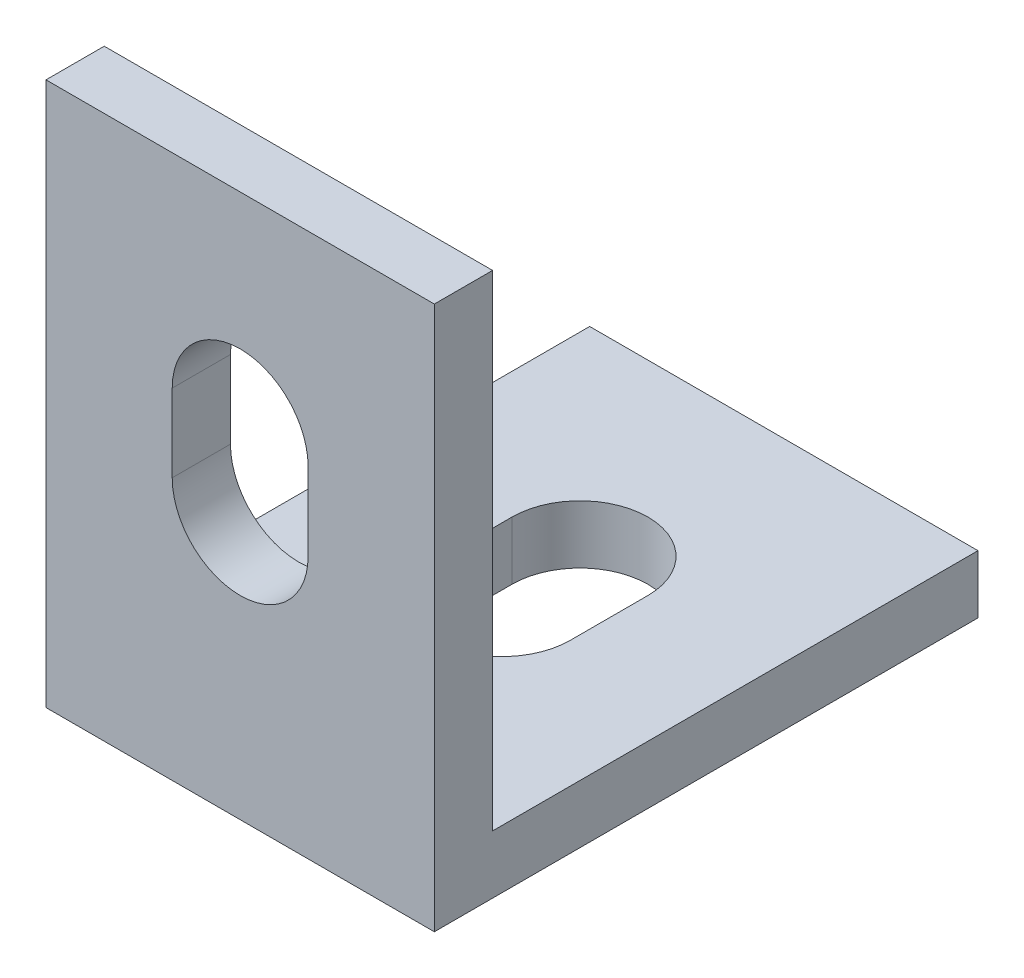
ISO-10303-21;
HEADER;
FILE_DESCRIPTION(('STEP AP214'),'2;1');
FILE_NAME('part.step','',(''),(''),'','','');
FILE_SCHEMA(('AUTOMOTIVE_DESIGN { 1 0 10303 214 1 1 1 1 }'));
ENDSEC;
DATA;
#1=APPLICATION_CONTEXT('core data for automotive mechanical design processes');
#2=APPLICATION_PROTOCOL_DEFINITION('international standard','automotive_design',2000,#1);
#3=PRODUCT_CONTEXT('',#1,'mechanical');
#4=PRODUCT('Part','Part','',(#3));
#5=PRODUCT_RELATED_PRODUCT_CATEGORY('part','',(#4));
#6=PRODUCT_DEFINITION_FORMATION('','',#4);
#7=PRODUCT_DEFINITION_CONTEXT('part definition',#1,'design');
#8=PRODUCT_DEFINITION('design','',#6,#7);
#9=PRODUCT_DEFINITION_SHAPE('','',#8);
#10=(LENGTH_UNIT() NAMED_UNIT(*) SI_UNIT(.MILLI.,.METRE.));
#11=(NAMED_UNIT(*) PLANE_ANGLE_UNIT() SI_UNIT($,.RADIAN.));
#12=(NAMED_UNIT(*) SI_UNIT($,.STERADIAN.) SOLID_ANGLE_UNIT());
#13=UNCERTAINTY_MEASURE_WITH_UNIT(LENGTH_MEASURE(1.E-05),#10,'distance_accuracy_value','');
#14=(GEOMETRIC_REPRESENTATION_CONTEXT(3) GLOBAL_UNCERTAINTY_ASSIGNED_CONTEXT((#13)) GLOBAL_UNIT_ASSIGNED_CONTEXT((#10,
#11,#12)) REPRESENTATION_CONTEXT('',''));
#15=CARTESIAN_POINT('',(0.,0.,0.));
#16=DIRECTION('',(0.,0.,1.));
#17=DIRECTION('',(1.,0.,0.));
#18=AXIS2_PLACEMENT_3D('',#15,#16,#17);
#19=CARTESIAN_POINT('',(-20.,0.,-3.));
#20=DIRECTION('',(0.,1.,0.));
#21=DIRECTION('',(0.,0.,1.));
#22=AXIS2_PLACEMENT_3D('',#19,#20,#21);
#23=PLANE('',#22);
#24=DIRECTION('',(0.,0.,1.));
#25=VECTOR('',#24,1.);
#26=CARTESIAN_POINT('',(0.,0.,-3.));
#27=LINE('',#26,#25);
#28=CARTESIAN_POINT('',(0.,0.,-3.));
#29=VERTEX_POINT('',#28);
#30=CARTESIAN_POINT('',(0.,0.,0.));
#31=VERTEX_POINT('',#30);
#32=EDGE_CURVE('E206',#29,#31,#27,.T.);
#33=ORIENTED_EDGE('',*,*,#32,.F.);
#34=DIRECTION('',(1.,0.,0.));
#35=VECTOR('',#34,1.);
#36=CARTESIAN_POINT('',(-20.,0.,-3.));
#37=LINE('',#36,#35);
#38=CARTESIAN_POINT('',(-20.,0.,-3.));
#39=VERTEX_POINT('',#38);
#40=EDGE_CURVE('E11',#39,#29,#37,.T.);
#41=ORIENTED_EDGE('',*,*,#40,.F.);
#42=DIRECTION('',(0.,0.,1.));
#43=VECTOR('',#42,1.);
#44=CARTESIAN_POINT('',(-20.,0.,-3.));
#45=LINE('',#44,#43);
#46=CARTESIAN_POINT('',(-20.,0.,0.));
#47=VERTEX_POINT('',#46);
#48=EDGE_CURVE('E207',#39,#47,#45,.T.);
#49=ORIENTED_EDGE('',*,*,#48,.T.);
#50=DIRECTION('',(1.,0.,0.));
#51=VECTOR('',#50,1.);
#52=CARTESIAN_POINT('',(-20.,0.,0.));
#53=LINE('',#52,#51);
#54=EDGE_CURVE('E39',#47,#31,#53,.T.);
#55=ORIENTED_EDGE('',*,*,#54,.T.);
#56=EDGE_LOOP('',(#33,#41,#49,#55));
#57=FACE_BOUND('',#56,.T.);
#58=ADVANCED_FACE('F36',(#57),#23,.T.);
#59=CARTESIAN_POINT('',(-20.,0.,-3.));
#60=DIRECTION('',(0.,0.,-1.));
#61=DIRECTION('',(0.,1.,0.));
#62=AXIS2_PLACEMENT_3D('',#59,#60,#61);
#63=PLANE('',#62);
#64=DIRECTION('',(0.,-1.,0.));
#65=VECTOR('',#64,1.);
#66=CARTESIAN_POINT('',(-6.5,-10.5,-3.));
#67=LINE('',#66,#65);
#68=CARTESIAN_POINT('',(-6.5,-10.5,-3.));
#69=VERTEX_POINT('',#68);
#70=CARTESIAN_POINT('',(-6.5,-14.5,-3.));
#71=VERTEX_POINT('',#70);
#72=EDGE_CURVE('E154',#69,#71,#67,.T.);
#73=ORIENTED_EDGE('',*,*,#72,.F.);
#74=CARTESIAN_POINT('',(-10.,-10.5,-3.));
#75=DIRECTION('',(0.,0.,-1.));
#76=DIRECTION('',(-1.,0.,0.));
#77=AXIS2_PLACEMENT_3D('',#74,#75,#76);
#78=CIRCLE('',#77,3.5);
#79=CARTESIAN_POINT('',(-13.5,-10.5,-3.));
#80=VERTEX_POINT('',#79);
#81=EDGE_CURVE('E165',#80,#69,#78,.T.);
#82=ORIENTED_EDGE('',*,*,#81,.F.);
#83=DIRECTION('',(0.,1.,0.));
#84=VECTOR('',#83,1.);
#85=CARTESIAN_POINT('',(-13.5,-10.5,-3.));
#86=LINE('',#85,#84);
#87=CARTESIAN_POINT('',(-13.5,-14.5,-3.));
#88=VERTEX_POINT('',#87);
#89=EDGE_CURVE('E52',#88,#80,#86,.T.);
#90=ORIENTED_EDGE('',*,*,#89,.F.);
#91=CARTESIAN_POINT('',(-10.,-14.5,-3.));
#92=DIRECTION('',(0.,0.,-1.));
#93=DIRECTION('',(-1.,0.,0.));
#94=AXIS2_PLACEMENT_3D('',#91,#92,#93);
#95=CIRCLE('',#94,3.5);
#96=EDGE_CURVE('E161',#71,#88,#95,.T.);
#97=ORIENTED_EDGE('',*,*,#96,.F.);
#98=EDGE_LOOP('',(#73,#82,#90,#97));
#99=FACE_BOUND('',#98,.T.);
#100=DIRECTION('',(0.,1.,0.));
#101=VECTOR('',#100,1.);
#102=CARTESIAN_POINT('',(0.,0.,-3.));
#103=LINE('',#102,#101);
#104=CARTESIAN_POINT('',(0.,-25.,-3.));
#105=VERTEX_POINT('',#104);
#106=EDGE_CURVE('E211',#105,#29,#103,.T.);
#107=ORIENTED_EDGE('',*,*,#106,.F.);
#108=DIRECTION('',(1.,0.,0.));
#109=VECTOR('',#108,1.);
#110=CARTESIAN_POINT('',(-20.,-25.,-3.));
#111=LINE('',#110,#109);
#112=CARTESIAN_POINT('',(-20.,-25.,-3.));
#113=VERTEX_POINT('',#112);
#114=EDGE_CURVE('E44',#113,#105,#111,.T.);
#115=ORIENTED_EDGE('',*,*,#114,.F.);
#116=DIRECTION('',(0.,1.,0.));
#117=VECTOR('',#116,1.);
#118=CARTESIAN_POINT('',(-20.,0.,-3.));
#119=LINE('',#118,#117);
#120=EDGE_CURVE('E223',#113,#39,#119,.T.);
#121=ORIENTED_EDGE('',*,*,#120,.T.);
#122=ORIENTED_EDGE('',*,*,#40,.T.);
#123=EDGE_LOOP('',(#107,#115,#121,#122));
#124=FACE_BOUND('',#123,.T.);
#125=ADVANCED_FACE('F258',(#99,#124),#63,.T.);
#126=CARTESIAN_POINT('',(-20.,-25.,-3.));
#127=DIRECTION('',(0.,1.,0.));
#128=DIRECTION('',(0.,0.,1.));
#129=AXIS2_PLACEMENT_3D('',#126,#127,#128);
#130=PLANE('',#129);
#131=DIRECTION('',(0.,0.,1.));
#132=VECTOR('',#131,1.);
#133=CARTESIAN_POINT('',(-13.5,-25.,-17.5));
#134=LINE('',#133,#132);
#135=CARTESIAN_POINT('',(-13.5,-25.,-17.5));
#136=VERTEX_POINT('',#135);
#137=CARTESIAN_POINT('',(-13.5,-25.,-13.5));
#138=VERTEX_POINT('',#137);
#139=EDGE_CURVE('E181',#136,#138,#134,.T.);
#140=ORIENTED_EDGE('',*,*,#139,.F.);
#141=CARTESIAN_POINT('',(-10.,-25.,-17.5));
#142=DIRECTION('',(0.,1.,0.));
#143=DIRECTION('',(0.,0.,1.));
#144=AXIS2_PLACEMENT_3D('',#141,#142,#143);
#145=CIRCLE('',#144,3.5);
#146=CARTESIAN_POINT('',(-6.5,-25.,-17.5));
#147=VERTEX_POINT('',#146);
#148=EDGE_CURVE('E174',#147,#136,#145,.T.);
#149=ORIENTED_EDGE('',*,*,#148,.F.);
#150=DIRECTION('',(0.,0.,-1.));
#151=VECTOR('',#150,1.);
#152=CARTESIAN_POINT('',(-6.5,-25.,-17.5));
#153=LINE('',#152,#151);
#154=CARTESIAN_POINT('',(-6.5,-25.,-13.5));
#155=VERTEX_POINT('',#154);
#156=EDGE_CURVE('E175',#155,#147,#153,.T.);
#157=ORIENTED_EDGE('',*,*,#156,.F.);
#158=CARTESIAN_POINT('',(-10.,-25.,-13.5));
#159=DIRECTION('',(0.,1.,0.));
#160=DIRECTION('',(0.,0.,1.));
#161=AXIS2_PLACEMENT_3D('',#158,#159,#160);
#162=CIRCLE('',#161,3.5);
#163=EDGE_CURVE('E178',#138,#155,#162,.T.);
#164=ORIENTED_EDGE('',*,*,#163,.F.);
#165=EDGE_LOOP('',(#140,#149,#157,#164));
#166=FACE_BOUND('',#165,.T.);
#167=DIRECTION('',(0.,0.,1.));
#168=VECTOR('',#167,1.);
#169=CARTESIAN_POINT('',(0.,-25.,-3.));
#170=LINE('',#169,#168);
#171=CARTESIAN_POINT('',(0.,-25.,-28.));
#172=VERTEX_POINT('',#171);
#173=EDGE_CURVE('E237',#172,#105,#170,.T.);
#174=ORIENTED_EDGE('',*,*,#173,.F.);
#175=DIRECTION('',(1.,0.,0.));
#176=VECTOR('',#175,1.);
#177=CARTESIAN_POINT('',(-20.,-25.,-28.));
#178=LINE('',#177,#176);
#179=CARTESIAN_POINT('',(-20.,-25.,-28.));
#180=VERTEX_POINT('',#179);
#181=EDGE_CURVE('E243',#180,#172,#178,.T.);
#182=ORIENTED_EDGE('',*,*,#181,.F.);
#183=DIRECTION('',(0.,0.,1.));
#184=VECTOR('',#183,1.);
#185=CARTESIAN_POINT('',(-20.,-25.,-3.));
#186=LINE('',#185,#184);
#187=EDGE_CURVE('E220',#180,#113,#186,.T.);
#188=ORIENTED_EDGE('',*,*,#187,.T.);
#189=ORIENTED_EDGE('',*,*,#114,.T.);
#190=EDGE_LOOP('',(#174,#182,#188,#189));
#191=FACE_BOUND('',#190,.T.);
#192=ADVANCED_FACE('F271',(#166,#191),#130,.T.);
#193=CARTESIAN_POINT('',(-20.,-28.,-28.));
#194=DIRECTION('',(0.,0.,-1.));
#195=DIRECTION('',(-1.,0.,0.));
#196=AXIS2_PLACEMENT_3D('',#193,#194,#195);
#197=PLANE('',#196);
#198=DIRECTION('',(0.,1.,0.));
#199=VECTOR('',#198,1.);
#200=CARTESIAN_POINT('',(0.,-28.,-28.));
#201=LINE('',#200,#199);
#202=CARTESIAN_POINT('',(0.,-28.,-28.));
#203=VERTEX_POINT('',#202);
#204=EDGE_CURVE('E234',#203,#172,#201,.T.);
#205=ORIENTED_EDGE('',*,*,#204,.F.);
#206=DIRECTION('',(1.,0.,0.));
#207=VECTOR('',#206,1.);
#208=CARTESIAN_POINT('',(-20.,-28.,-28.));
#209=LINE('',#208,#207);
#210=CARTESIAN_POINT('',(-20.,-28.,-28.));
#211=VERTEX_POINT('',#210);
#212=EDGE_CURVE('E245',#211,#203,#209,.T.);
#213=ORIENTED_EDGE('',*,*,#212,.F.);
#214=DIRECTION('',(0.,1.,0.));
#215=VECTOR('',#214,1.);
#216=CARTESIAN_POINT('',(-20.,-28.,-28.));
#217=LINE('',#216,#215);
#218=EDGE_CURVE('E217',#211,#180,#217,.T.);
#219=ORIENTED_EDGE('',*,*,#218,.T.);
#220=ORIENTED_EDGE('',*,*,#181,.T.);
#221=EDGE_LOOP('',(#205,#213,#219,#220));
#222=FACE_BOUND('',#221,.T.);
#223=ADVANCED_FACE('F269',(#222),#197,.T.);
#224=CARTESIAN_POINT('',(-20.,-28.,0.));
#225=DIRECTION('',(0.,-1.,0.));
#226=DIRECTION('',(0.,0.,-1.));
#227=AXIS2_PLACEMENT_3D('',#224,#225,#226);
#228=PLANE('',#227);
#229=DIRECTION('',(0.,0.,1.));
#230=VECTOR('',#229,1.);
#231=CARTESIAN_POINT('',(-13.5,-28.,-17.5));
#232=LINE('',#231,#230);
#233=CARTESIAN_POINT('',(-13.5,-28.,-17.5));
#234=VERTEX_POINT('',#233);
#235=CARTESIAN_POINT('',(-13.5,-28.,-13.5));
#236=VERTEX_POINT('',#235);
#237=EDGE_CURVE('E177',#234,#236,#232,.T.);
#238=ORIENTED_EDGE('',*,*,#237,.T.);
#239=CARTESIAN_POINT('',(-10.,-28.,-13.5));
#240=DIRECTION('',(0.,-1.,0.));
#241=DIRECTION('',(0.,0.,-1.));
#242=AXIS2_PLACEMENT_3D('',#239,#240,#241);
#243=CIRCLE('',#242,3.5);
#244=CARTESIAN_POINT('',(-6.5,-28.,-13.5));
#245=VERTEX_POINT('',#244);
#246=EDGE_CURVE('E198',#236,#245,#243,.F.);
#247=ORIENTED_EDGE('',*,*,#246,.T.);
#248=DIRECTION('',(0.,0.,-1.));
#249=VECTOR('',#248,1.);
#250=CARTESIAN_POINT('',(-6.5,-28.,-17.5));
#251=LINE('',#250,#249);
#252=CARTESIAN_POINT('',(-6.5,-28.,-17.5));
#253=VERTEX_POINT('',#252);
#254=EDGE_CURVE('E194',#245,#253,#251,.T.);
#255=ORIENTED_EDGE('',*,*,#254,.T.);
#256=CARTESIAN_POINT('',(-10.,-28.,-17.5));
#257=DIRECTION('',(0.,-1.,0.));
#258=DIRECTION('',(0.,0.,-1.));
#259=AXIS2_PLACEMENT_3D('',#256,#257,#258);
#260=CIRCLE('',#259,3.5);
#261=EDGE_CURVE('E189',#253,#234,#260,.F.);
#262=ORIENTED_EDGE('',*,*,#261,.T.);
#263=EDGE_LOOP('',(#238,#247,#255,#262));
#264=FACE_BOUND('',#263,.T.);
#265=DIRECTION('',(0.,0.,-1.));
#266=VECTOR('',#265,1.);
#267=CARTESIAN_POINT('',(0.,-28.,0.));
#268=LINE('',#267,#266);
#269=CARTESIAN_POINT('',(0.,-28.,0.));
#270=VERTEX_POINT('',#269);
#271=EDGE_CURVE('E231',#270,#203,#268,.T.);
#272=ORIENTED_EDGE('',*,*,#271,.F.);
#273=DIRECTION('',(1.,0.,0.));
#274=VECTOR('',#273,1.);
#275=CARTESIAN_POINT('',(-20.,-28.,0.));
#276=LINE('',#275,#274);
#277=CARTESIAN_POINT('',(-20.,-28.,0.));
#278=VERTEX_POINT('',#277);
#279=EDGE_CURVE('E246',#278,#270,#276,.T.);
#280=ORIENTED_EDGE('',*,*,#279,.F.);
#281=DIRECTION('',(0.,0.,-1.));
#282=VECTOR('',#281,1.);
#283=CARTESIAN_POINT('',(-20.,-28.,0.));
#284=LINE('',#283,#282);
#285=EDGE_CURVE('E214',#278,#211,#284,.T.);
#286=ORIENTED_EDGE('',*,*,#285,.T.);
#287=ORIENTED_EDGE('',*,*,#212,.T.);
#288=EDGE_LOOP('',(#272,#280,#286,#287));
#289=FACE_BOUND('',#288,.T.);
#290=ADVANCED_FACE('F266',(#264,#289),#228,.T.);
#291=CARTESIAN_POINT('',(-20.,0.,0.));
#292=DIRECTION('',(0.,0.,1.));
#293=DIRECTION('',(1.,0.,0.));
#294=AXIS2_PLACEMENT_3D('',#291,#292,#293);
#295=PLANE('',#294);
#296=DIRECTION('',(0.,-1.,0.));
#297=VECTOR('',#296,1.);
#298=CARTESIAN_POINT('',(-6.5,-10.5,0.));
#299=LINE('',#298,#297);
#300=CARTESIAN_POINT('',(-6.5,-10.5,0.));
#301=VERTEX_POINT('',#300);
#302=CARTESIAN_POINT('',(-6.5,-14.5,0.));
#303=VERTEX_POINT('',#302);
#304=EDGE_CURVE('E151',#301,#303,#299,.T.);
#305=ORIENTED_EDGE('',*,*,#304,.T.);
#306=CARTESIAN_POINT('',(-10.,-14.5,0.));
#307=DIRECTION('',(0.,0.,1.));
#308=DIRECTION('',(1.,0.,0.));
#309=AXIS2_PLACEMENT_3D('',#306,#307,#308);
#310=CIRCLE('',#309,3.5);
#311=CARTESIAN_POINT('',(-13.5,-14.5,0.));
#312=VERTEX_POINT('',#311);
#313=EDGE_CURVE('E138',#303,#312,#310,.F.);
#314=ORIENTED_EDGE('',*,*,#313,.T.);
#315=DIRECTION('',(0.,1.,0.));
#316=VECTOR('',#315,1.);
#317=CARTESIAN_POINT('',(-13.5,-10.5,0.));
#318=LINE('',#317,#316);
#319=CARTESIAN_POINT('',(-13.5,-10.5,0.));
#320=VERTEX_POINT('',#319);
#321=EDGE_CURVE('E169',#312,#320,#318,.T.);
#322=ORIENTED_EDGE('',*,*,#321,.T.);
#323=CARTESIAN_POINT('',(-10.,-10.5,0.));
#324=DIRECTION('',(0.,0.,1.));
#325=DIRECTION('',(1.,0.,0.));
#326=AXIS2_PLACEMENT_3D('',#323,#324,#325);
#327=CIRCLE('',#326,3.5);
#328=EDGE_CURVE('E159',#320,#301,#327,.F.);
#329=ORIENTED_EDGE('',*,*,#328,.T.);
#330=EDGE_LOOP('',(#305,#314,#322,#329));
#331=FACE_BOUND('',#330,.T.);
#332=DIRECTION('',(0.,-1.,0.));
#333=VECTOR('',#332,1.);
#334=CARTESIAN_POINT('',(0.,0.,0.));
#335=LINE('',#334,#333);
#336=EDGE_CURVE('E228',#31,#270,#335,.T.);
#337=ORIENTED_EDGE('',*,*,#336,.F.);
#338=ORIENTED_EDGE('',*,*,#54,.F.);
#339=DIRECTION('',(0.,-1.,0.));
#340=VECTOR('',#339,1.);
#341=CARTESIAN_POINT('',(-20.,0.,0.));
#342=LINE('',#341,#340);
#343=EDGE_CURVE('E210',#47,#278,#342,.T.);
#344=ORIENTED_EDGE('',*,*,#343,.T.);
#345=ORIENTED_EDGE('',*,*,#279,.T.);
#346=EDGE_LOOP('',(#337,#338,#344,#345));
#347=FACE_BOUND('',#346,.T.);
#348=ADVANCED_FACE('F157',(#331,#347),#295,.T.);
#349=CARTESIAN_POINT('',(-20.,0.,0.));
#350=DIRECTION('',(1.,0.,0.));
#351=DIRECTION('',(0.,0.,-1.));
#352=AXIS2_PLACEMENT_3D('',#349,#350,#351);
#353=PLANE('',#352);
#354=ORIENTED_EDGE('',*,*,#48,.F.);
#355=ORIENTED_EDGE('',*,*,#120,.F.);
#356=ORIENTED_EDGE('',*,*,#187,.F.);
#357=ORIENTED_EDGE('',*,*,#218,.F.);
#358=ORIENTED_EDGE('',*,*,#285,.F.);
#359=ORIENTED_EDGE('',*,*,#343,.F.);
#360=EDGE_LOOP('',(#354,#355,#356,#357,#358,#359));
#361=FACE_BOUND('',#360,.T.);
#362=ADVANCED_FACE('F261',(#361),#353,.F.);
#363=CARTESIAN_POINT('',(0.,0.,0.));
#364=DIRECTION('',(1.,0.,0.));
#365=DIRECTION('',(0.,0.,-1.));
#366=AXIS2_PLACEMENT_3D('',#363,#364,#365);
#367=PLANE('',#366);
#368=ORIENTED_EDGE('',*,*,#32,.T.);
#369=ORIENTED_EDGE('',*,*,#336,.T.);
#370=ORIENTED_EDGE('',*,*,#271,.T.);
#371=ORIENTED_EDGE('',*,*,#204,.T.);
#372=ORIENTED_EDGE('',*,*,#173,.T.);
#373=ORIENTED_EDGE('',*,*,#106,.T.);
#374=EDGE_LOOP('',(#368,#369,#370,#371,#372,#373));
#375=FACE_BOUND('',#374,.T.);
#376=ADVANCED_FACE('F254',(#375),#367,.T.);
#377=CARTESIAN_POINT('',(-13.5,-41.0384048104053,-17.5));
#378=DIRECTION('',(-1.,0.,0.));
#379=DIRECTION('',(0.,0.,1.));
#380=AXIS2_PLACEMENT_3D('',#377,#378,#379);
#381=PLANE('',#380);
#382=DIRECTION('',(0.,1.,0.));
#383=VECTOR('',#382,1.);
#384=CARTESIAN_POINT('',(-13.5,-41.0384048104053,-17.5));
#385=LINE('',#384,#383);
#386=EDGE_CURVE('E192',#234,#136,#385,.T.);
#387=ORIENTED_EDGE('',*,*,#386,.T.);
#388=ORIENTED_EDGE('',*,*,#139,.T.);
#389=DIRECTION('',(0.,1.,0.));
#390=VECTOR('',#389,1.);
#391=CARTESIAN_POINT('',(-13.5,-41.0384048104053,-13.5));
#392=LINE('',#391,#390);
#393=EDGE_CURVE('E188',#236,#138,#392,.T.);
#394=ORIENTED_EDGE('',*,*,#393,.F.);
#395=ORIENTED_EDGE('',*,*,#237,.F.);
#396=EDGE_LOOP('',(#387,#388,#394,#395));
#397=FACE_BOUND('',#396,.T.);
#398=ADVANCED_FACE('F378',(#397),#381,.F.);
#399=CARTESIAN_POINT('',(-10.,-41.0384048104053,-13.5));
#400=DIRECTION('',(0.,1.,0.));
#401=DIRECTION('',(0.,0.,1.));
#402=AXIS2_PLACEMENT_3D('',#399,#400,#401);
#403=CYLINDRICAL_SURFACE('',#402,3.5);
#404=ORIENTED_EDGE('',*,*,#393,.T.);
#405=ORIENTED_EDGE('',*,*,#163,.T.);
#406=DIRECTION('',(0.,1.,0.));
#407=VECTOR('',#406,1.);
#408=CARTESIAN_POINT('',(-6.5,-41.0384048104053,-13.5));
#409=LINE('',#408,#407);
#410=EDGE_CURVE('E197',#245,#155,#409,.T.);
#411=ORIENTED_EDGE('',*,*,#410,.F.);
#412=ORIENTED_EDGE('',*,*,#246,.F.);
#413=EDGE_LOOP('',(#404,#405,#411,#412));
#414=FACE_BOUND('',#413,.T.);
#415=ADVANCED_FACE('F369',(#414),#403,.F.);
#416=CARTESIAN_POINT('',(-6.5,-41.0384048104053,-17.5));
#417=DIRECTION('',(1.,0.,0.));
#418=DIRECTION('',(0.,0.,-1.));
#419=AXIS2_PLACEMENT_3D('',#416,#417,#418);
#420=PLANE('',#419);
#421=ORIENTED_EDGE('',*,*,#410,.T.);
#422=ORIENTED_EDGE('',*,*,#156,.T.);
#423=DIRECTION('',(0.,1.,0.));
#424=VECTOR('',#423,1.);
#425=CARTESIAN_POINT('',(-6.5,-41.0384048104053,-17.5));
#426=LINE('',#425,#424);
#427=EDGE_CURVE('E193',#253,#147,#426,.T.);
#428=ORIENTED_EDGE('',*,*,#427,.F.);
#429=ORIENTED_EDGE('',*,*,#254,.F.);
#430=EDGE_LOOP('',(#421,#422,#428,#429));
#431=FACE_BOUND('',#430,.T.);
#432=ADVANCED_FACE('F360',(#431),#420,.F.);
#433=CARTESIAN_POINT('',(-10.,-41.0384048104053,-17.5));
#434=DIRECTION('',(0.,1.,0.));
#435=DIRECTION('',(0.,0.,1.));
#436=AXIS2_PLACEMENT_3D('',#433,#434,#435);
#437=CYLINDRICAL_SURFACE('',#436,3.5);
#438=ORIENTED_EDGE('',*,*,#427,.T.);
#439=ORIENTED_EDGE('',*,*,#148,.T.);
#440=ORIENTED_EDGE('',*,*,#386,.F.);
#441=ORIENTED_EDGE('',*,*,#261,.F.);
#442=EDGE_LOOP('',(#438,#439,#440,#441));
#443=FACE_BOUND('',#442,.T.);
#444=ADVANCED_FACE('F299',(#443),#437,.F.);
#445=CARTESIAN_POINT('',(-6.5,-10.5,13.0384048104053));
#446=DIRECTION('',(1.,0.,0.));
#447=DIRECTION('',(0.,0.,-1.));
#448=AXIS2_PLACEMENT_3D('',#445,#446,#447);
#449=PLANE('',#448);
#450=DIRECTION('',(0.,0.,-1.));
#451=VECTOR('',#450,1.);
#452=CARTESIAN_POINT('',(-6.5,-10.5,13.0384048104053));
#453=LINE('',#452,#451);
#454=EDGE_CURVE('E60',#301,#69,#453,.T.);
#455=ORIENTED_EDGE('',*,*,#454,.T.);
#456=ORIENTED_EDGE('',*,*,#72,.T.);
#457=DIRECTION('',(0.,0.,-1.));
#458=VECTOR('',#457,1.);
#459=CARTESIAN_POINT('',(-6.5,-14.5,13.0384048104053));
#460=LINE('',#459,#458);
#461=EDGE_CURVE('E142',#303,#71,#460,.T.);
#462=ORIENTED_EDGE('',*,*,#461,.F.);
#463=ORIENTED_EDGE('',*,*,#304,.F.);
#464=EDGE_LOOP('',(#455,#456,#462,#463));
#465=FACE_BOUND('',#464,.T.);
#466=ADVANCED_FACE('F150',(#465),#449,.F.);
#467=CARTESIAN_POINT('',(-10.,-14.5,13.0384048104053));
#468=DIRECTION('',(0.,0.,-1.));
#469=DIRECTION('',(-1.,0.,0.));
#470=AXIS2_PLACEMENT_3D('',#467,#468,#469);
#471=CYLINDRICAL_SURFACE('',#470,3.5);
#472=ORIENTED_EDGE('',*,*,#461,.T.);
#473=ORIENTED_EDGE('',*,*,#96,.T.);
#474=DIRECTION('',(0.,0.,-1.));
#475=VECTOR('',#474,1.);
#476=CARTESIAN_POINT('',(-13.5,-14.5,13.0384048104053));
#477=LINE('',#476,#475);
#478=EDGE_CURVE('E144',#312,#88,#477,.T.);
#479=ORIENTED_EDGE('',*,*,#478,.F.);
#480=ORIENTED_EDGE('',*,*,#313,.F.);
#481=EDGE_LOOP('',(#472,#473,#479,#480));
#482=FACE_BOUND('',#481,.T.);
#483=ADVANCED_FACE('F140',(#482),#471,.F.);
#484=CARTESIAN_POINT('',(-13.5,-10.5,13.0384048104053));
#485=DIRECTION('',(-1.,0.,0.));
#486=DIRECTION('',(0.,0.,1.));
#487=AXIS2_PLACEMENT_3D('',#484,#485,#486);
#488=PLANE('',#487);
#489=ORIENTED_EDGE('',*,*,#478,.T.);
#490=ORIENTED_EDGE('',*,*,#89,.T.);
#491=DIRECTION('',(0.,0.,-1.));
#492=VECTOR('',#491,1.);
#493=CARTESIAN_POINT('',(-13.5,-10.5,13.0384048104053));
#494=LINE('',#493,#492);
#495=EDGE_CURVE('E168',#320,#80,#494,.T.);
#496=ORIENTED_EDGE('',*,*,#495,.F.);
#497=ORIENTED_EDGE('',*,*,#321,.F.);
#498=EDGE_LOOP('',(#489,#490,#496,#497));
#499=FACE_BOUND('',#498,.T.);
#500=ADVANCED_FACE('F329',(#499),#488,.F.);
#501=CARTESIAN_POINT('',(-10.,-10.5,13.0384048104053));
#502=DIRECTION('',(0.,0.,-1.));
#503=DIRECTION('',(-1.,0.,0.));
#504=AXIS2_PLACEMENT_3D('',#501,#502,#503);
#505=CYLINDRICAL_SURFACE('',#504,3.5);
#506=ORIENTED_EDGE('',*,*,#495,.T.);
#507=ORIENTED_EDGE('',*,*,#81,.T.);
#508=ORIENTED_EDGE('',*,*,#454,.F.);
#509=ORIENTED_EDGE('',*,*,#328,.F.);
#510=EDGE_LOOP('',(#506,#507,#508,#509));
#511=FACE_BOUND('',#510,.T.);
#512=ADVANCED_FACE('F339',(#511),#505,.F.);
#513=CLOSED_SHELL('',(#58,#125,#192,#223,#290,#348,#362,#376,#398,#415,#432,#444,#466,#483,#500,#512));
#514=MANIFOLD_SOLID_BREP('B2',#513);
#515=ADVANCED_BREP_SHAPE_REPRESENTATION('',(#18,#514),#14);
#516=SHAPE_DEFINITION_REPRESENTATION(#9,#515);
ENDSEC;
END-ISO-10303-21;
